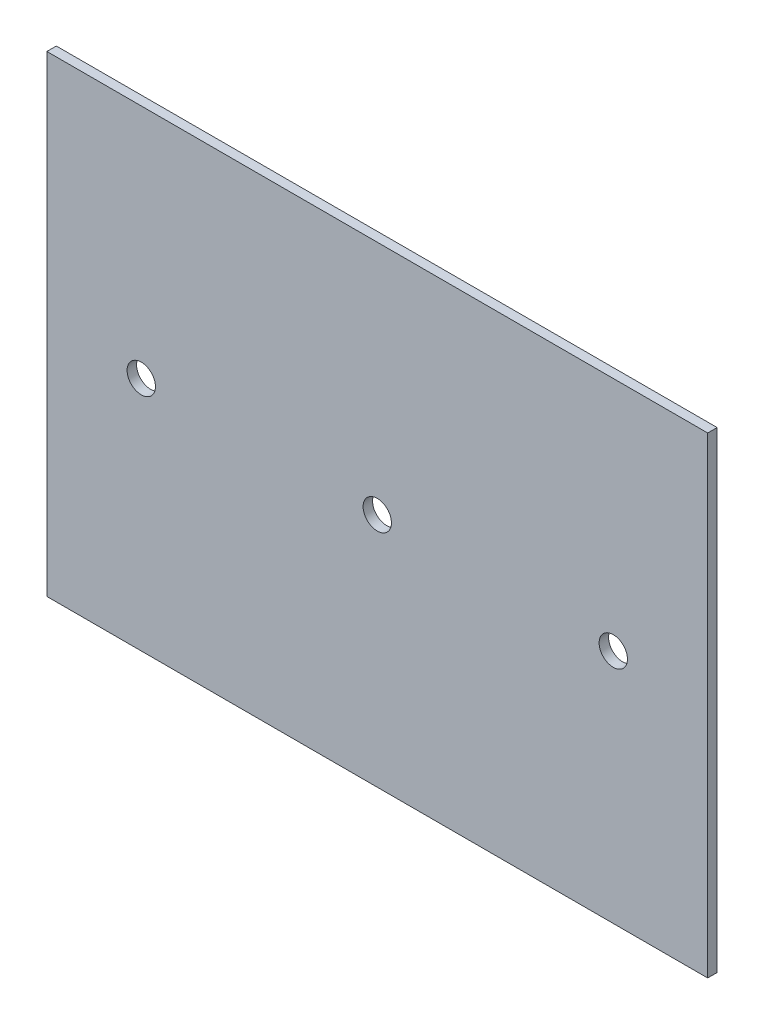
ISO-10303-21;
HEADER;
FILE_DESCRIPTION(('STEP AP214'),'2;1');
FILE_NAME('part.step','',(''),(''),'','','');
FILE_SCHEMA(('AUTOMOTIVE_DESIGN { 1 0 10303 214 1 1 1 1 }'));
ENDSEC;
DATA;
#1=APPLICATION_CONTEXT('core data for automotive mechanical design processes');
#2=APPLICATION_PROTOCOL_DEFINITION('international standard','automotive_design',2000,#1);
#3=PRODUCT_CONTEXT('',#1,'mechanical');
#4=PRODUCT('Part','Part','',(#3));
#5=PRODUCT_RELATED_PRODUCT_CATEGORY('part','',(#4));
#6=PRODUCT_DEFINITION_FORMATION('','',#4);
#7=PRODUCT_DEFINITION_CONTEXT('part definition',#1,'design');
#8=PRODUCT_DEFINITION('design','',#6,#7);
#9=PRODUCT_DEFINITION_SHAPE('','',#8);
#10=(LENGTH_UNIT() NAMED_UNIT(*) SI_UNIT(.MILLI.,.METRE.));
#11=(NAMED_UNIT(*) PLANE_ANGLE_UNIT() SI_UNIT($,.RADIAN.));
#12=(NAMED_UNIT(*) SI_UNIT($,.STERADIAN.) SOLID_ANGLE_UNIT());
#13=UNCERTAINTY_MEASURE_WITH_UNIT(LENGTH_MEASURE(1.E-05),#10,'distance_accuracy_value','');
#14=(GEOMETRIC_REPRESENTATION_CONTEXT(3) GLOBAL_UNCERTAINTY_ASSIGNED_CONTEXT((#13)) GLOBAL_UNIT_ASSIGNED_CONTEXT((#10,
#11,#12)) REPRESENTATION_CONTEXT('',''));
#15=CARTESIAN_POINT('',(0.,0.,0.));
#16=DIRECTION('',(0.,0.,1.));
#17=DIRECTION('',(1.,0.,0.));
#18=AXIS2_PLACEMENT_3D('',#15,#16,#17);
#19=CARTESIAN_POINT('',(35.,-25.,1.));
#20=DIRECTION('',(-1.,0.,0.));
#21=DIRECTION('',(0.,0.,1.));
#22=AXIS2_PLACEMENT_3D('',#19,#20,#21);
#23=PLANE('',#22);
#24=DIRECTION('',(0.,1.,0.));
#25=VECTOR('',#24,1.);
#26=CARTESIAN_POINT('',(35.,-25.,0.));
#27=LINE('',#26,#25);
#28=CARTESIAN_POINT('',(35.,-25.,0.));
#29=VERTEX_POINT('',#28);
#30=CARTESIAN_POINT('',(35.,25.,0.));
#31=VERTEX_POINT('',#30);
#32=EDGE_CURVE('E96',#29,#31,#27,.T.);
#33=ORIENTED_EDGE('',*,*,#32,.T.);
#34=DIRECTION('',(0.,0.,-1.));
#35=VECTOR('',#34,1.);
#36=CARTESIAN_POINT('',(35.,25.,1.));
#37=LINE('',#36,#35);
#38=CARTESIAN_POINT('',(35.,25.,1.));
#39=VERTEX_POINT('',#38);
#40=EDGE_CURVE('E11',#39,#31,#37,.T.);
#41=ORIENTED_EDGE('',*,*,#40,.F.);
#42=DIRECTION('',(0.,1.,0.));
#43=VECTOR('',#42,1.);
#44=CARTESIAN_POINT('',(35.,-25.,1.));
#45=LINE('',#44,#43);
#46=CARTESIAN_POINT('',(35.,-25.,1.));
#47=VERTEX_POINT('',#46);
#48=EDGE_CURVE('E84',#47,#39,#45,.T.);
#49=ORIENTED_EDGE('',*,*,#48,.F.);
#50=DIRECTION('',(0.,0.,-1.));
#51=VECTOR('',#50,1.);
#52=CARTESIAN_POINT('',(35.,-25.,1.));
#53=LINE('',#52,#51);
#54=EDGE_CURVE('E92',#47,#29,#53,.T.);
#55=ORIENTED_EDGE('',*,*,#54,.T.);
#56=EDGE_LOOP('',(#33,#41,#49,#55));
#57=FACE_BOUND('',#56,.T.);
#58=ADVANCED_FACE('F33',(#57),#23,.F.);
#59=CARTESIAN_POINT('',(-35.,25.,1.));
#60=DIRECTION('',(0.,-1.,0.));
#61=DIRECTION('',(0.,0.,-1.));
#62=AXIS2_PLACEMENT_3D('',#59,#60,#61);
#63=PLANE('',#62);
#64=DIRECTION('',(-1.,0.,0.));
#65=VECTOR('',#64,1.);
#66=CARTESIAN_POINT('',(-35.,25.,0.));
#67=LINE('',#66,#65);
#68=CARTESIAN_POINT('',(-35.,25.,0.));
#69=VERTEX_POINT('',#68);
#70=EDGE_CURVE('E88',#31,#69,#67,.T.);
#71=ORIENTED_EDGE('',*,*,#70,.T.);
#72=DIRECTION('',(0.,0.,-1.));
#73=VECTOR('',#72,1.);
#74=CARTESIAN_POINT('',(-35.,25.,1.));
#75=LINE('',#74,#73);
#76=CARTESIAN_POINT('',(-35.,25.,1.));
#77=VERTEX_POINT('',#76);
#78=EDGE_CURVE('E41',#77,#69,#75,.T.);
#79=ORIENTED_EDGE('',*,*,#78,.F.);
#80=DIRECTION('',(-1.,0.,0.));
#81=VECTOR('',#80,1.);
#82=CARTESIAN_POINT('',(-35.,25.,1.));
#83=LINE('',#82,#81);
#84=EDGE_CURVE('E79',#39,#77,#83,.T.);
#85=ORIENTED_EDGE('',*,*,#84,.F.);
#86=ORIENTED_EDGE('',*,*,#40,.T.);
#87=EDGE_LOOP('',(#71,#79,#85,#86));
#88=FACE_BOUND('',#87,.T.);
#89=ADVANCED_FACE('F87',(#88),#63,.F.);
#90=CARTESIAN_POINT('',(-35.,-25.,1.));
#91=DIRECTION('',(1.,0.,0.));
#92=DIRECTION('',(0.,0.,-1.));
#93=AXIS2_PLACEMENT_3D('',#90,#91,#92);
#94=PLANE('',#93);
#95=DIRECTION('',(0.,-1.,0.));
#96=VECTOR('',#95,1.);
#97=CARTESIAN_POINT('',(-35.,-25.,0.));
#98=LINE('',#97,#96);
#99=CARTESIAN_POINT('',(-35.,-25.,0.));
#100=VERTEX_POINT('',#99);
#101=EDGE_CURVE('E66',#69,#100,#98,.T.);
#102=ORIENTED_EDGE('',*,*,#101,.T.);
#103=DIRECTION('',(0.,0.,-1.));
#104=VECTOR('',#103,1.);
#105=CARTESIAN_POINT('',(-35.,-25.,1.));
#106=LINE('',#105,#104);
#107=CARTESIAN_POINT('',(-35.,-25.,1.));
#108=VERTEX_POINT('',#107);
#109=EDGE_CURVE('E89',#108,#100,#106,.T.);
#110=ORIENTED_EDGE('',*,*,#109,.F.);
#111=DIRECTION('',(0.,-1.,0.));
#112=VECTOR('',#111,1.);
#113=CARTESIAN_POINT('',(-35.,-25.,1.));
#114=LINE('',#113,#112);
#115=EDGE_CURVE('E82',#77,#108,#114,.T.);
#116=ORIENTED_EDGE('',*,*,#115,.F.);
#117=ORIENTED_EDGE('',*,*,#78,.T.);
#118=EDGE_LOOP('',(#102,#110,#116,#117));
#119=FACE_BOUND('',#118,.T.);
#120=ADVANCED_FACE('F90',(#119),#94,.F.);
#121=CARTESIAN_POINT('',(-35.,-25.,1.));
#122=DIRECTION('',(0.,1.,0.));
#123=DIRECTION('',(0.,0.,1.));
#124=AXIS2_PLACEMENT_3D('',#121,#122,#123);
#125=PLANE('',#124);
#126=DIRECTION('',(1.,0.,0.));
#127=VECTOR('',#126,1.);
#128=CARTESIAN_POINT('',(-35.,-25.,0.));
#129=LINE('',#128,#127);
#130=EDGE_CURVE('E72',#100,#29,#129,.T.);
#131=ORIENTED_EDGE('',*,*,#130,.T.);
#132=ORIENTED_EDGE('',*,*,#54,.F.);
#133=DIRECTION('',(1.,0.,0.));
#134=VECTOR('',#133,1.);
#135=CARTESIAN_POINT('',(-35.,-25.,1.));
#136=LINE('',#135,#134);
#137=EDGE_CURVE('E49',#108,#47,#136,.T.);
#138=ORIENTED_EDGE('',*,*,#137,.F.);
#139=ORIENTED_EDGE('',*,*,#109,.T.);
#140=EDGE_LOOP('',(#131,#132,#138,#139));
#141=FACE_BOUND('',#140,.T.);
#142=ADVANCED_FACE('F104',(#141),#125,.F.);
#143=CARTESIAN_POINT('',(0.,0.,1.));
#144=DIRECTION('',(0.,0.,-1.));
#145=DIRECTION('',(-1.,0.,0.));
#146=AXIS2_PLACEMENT_3D('',#143,#144,#145);
#147=PLANE('',#146);
#148=CARTESIAN_POINT('',(-25.,0.,1.));
#149=DIRECTION('',(0.,0.,-1.));
#150=DIRECTION('',(-1.,0.,0.));
#151=AXIS2_PLACEMENT_3D('',#148,#149,#150);
#152=CIRCLE('',#151,1.5);
#153=CARTESIAN_POINT('',(-26.5,0.,1.));
#154=VERTEX_POINT('',#153);
#155=EDGE_CURVE('E121',#154,#154,#152,.F.);
#156=ORIENTED_EDGE('',*,*,#155,.F.);
#157=EDGE_LOOP('',(#156));
#158=FACE_BOUND('',#157,.T.);
#159=CARTESIAN_POINT('',(0.,0.,1.));
#160=DIRECTION('',(0.,0.,-1.));
#161=DIRECTION('',(-1.,0.,0.));
#162=AXIS2_PLACEMENT_3D('',#159,#160,#161);
#163=CIRCLE('',#162,1.5);
#164=CARTESIAN_POINT('',(-1.5,0.,1.));
#165=VERTEX_POINT('',#164);
#166=EDGE_CURVE('E115',#165,#165,#163,.F.);
#167=ORIENTED_EDGE('',*,*,#166,.F.);
#168=EDGE_LOOP('',(#167));
#169=FACE_BOUND('',#168,.T.);
#170=CARTESIAN_POINT('',(25.,0.,1.));
#171=DIRECTION('',(0.,0.,-1.));
#172=DIRECTION('',(-1.,0.,0.));
#173=AXIS2_PLACEMENT_3D('',#170,#171,#172);
#174=CIRCLE('',#173,1.5);
#175=CARTESIAN_POINT('',(23.5,0.,1.));
#176=VERTEX_POINT('',#175);
#177=EDGE_CURVE('E99',#176,#176,#174,.F.);
#178=ORIENTED_EDGE('',*,*,#177,.F.);
#179=EDGE_LOOP('',(#178));
#180=FACE_BOUND('',#179,.T.);
#181=ORIENTED_EDGE('',*,*,#48,.T.);
#182=ORIENTED_EDGE('',*,*,#84,.T.);
#183=ORIENTED_EDGE('',*,*,#115,.T.);
#184=ORIENTED_EDGE('',*,*,#137,.T.);
#185=EDGE_LOOP('',(#181,#182,#183,#184));
#186=FACE_BOUND('',#185,.T.);
#187=ADVANCED_FACE('F80',(#158,#169,#180,#186),#147,.F.);
#188=CARTESIAN_POINT('',(0.,0.,0.));
#189=DIRECTION('',(0.,0.,-1.));
#190=DIRECTION('',(-1.,0.,0.));
#191=AXIS2_PLACEMENT_3D('',#188,#189,#190);
#192=PLANE('',#191);
#193=CARTESIAN_POINT('',(-25.,0.,0.));
#194=DIRECTION('',(0.,0.,-1.));
#195=DIRECTION('',(-1.,0.,0.));
#196=AXIS2_PLACEMENT_3D('',#193,#194,#195);
#197=CIRCLE('',#196,1.5);
#198=CARTESIAN_POINT('',(-26.5,0.,0.));
#199=VERTEX_POINT('',#198);
#200=EDGE_CURVE('E124',#199,#199,#197,.T.);
#201=ORIENTED_EDGE('',*,*,#200,.F.);
#202=EDGE_LOOP('',(#201));
#203=FACE_BOUND('',#202,.T.);
#204=CARTESIAN_POINT('',(0.,0.,0.));
#205=DIRECTION('',(0.,0.,-1.));
#206=DIRECTION('',(-1.,0.,0.));
#207=AXIS2_PLACEMENT_3D('',#204,#205,#206);
#208=CIRCLE('',#207,1.5);
#209=CARTESIAN_POINT('',(-1.5,0.,0.));
#210=VERTEX_POINT('',#209);
#211=EDGE_CURVE('E118',#210,#210,#208,.T.);
#212=ORIENTED_EDGE('',*,*,#211,.F.);
#213=EDGE_LOOP('',(#212));
#214=FACE_BOUND('',#213,.T.);
#215=CARTESIAN_POINT('',(25.,0.,0.));
#216=DIRECTION('',(0.,0.,-1.));
#217=DIRECTION('',(-1.,0.,0.));
#218=AXIS2_PLACEMENT_3D('',#215,#216,#217);
#219=CIRCLE('',#218,1.5);
#220=CARTESIAN_POINT('',(23.5,0.,0.));
#221=VERTEX_POINT('',#220);
#222=EDGE_CURVE('E112',#221,#221,#219,.T.);
#223=ORIENTED_EDGE('',*,*,#222,.F.);
#224=EDGE_LOOP('',(#223));
#225=FACE_BOUND('',#224,.T.);
#226=ORIENTED_EDGE('',*,*,#32,.F.);
#227=ORIENTED_EDGE('',*,*,#130,.F.);
#228=ORIENTED_EDGE('',*,*,#101,.F.);
#229=ORIENTED_EDGE('',*,*,#70,.F.);
#230=EDGE_LOOP('',(#226,#227,#228,#229));
#231=FACE_BOUND('',#230,.T.);
#232=ADVANCED_FACE('F107',(#203,#214,#225,#231),#192,.T.);
#233=CARTESIAN_POINT('',(25.,0.,5.24264068711929));
#234=DIRECTION('',(0.,0.,-1.));
#235=DIRECTION('',(-1.,0.,0.));
#236=AXIS2_PLACEMENT_3D('',#233,#234,#235);
#237=CYLINDRICAL_SURFACE('',#236,1.5);
#238=ORIENTED_EDGE('',*,*,#177,.T.);
#239=EDGE_LOOP('',(#238));
#240=FACE_BOUND('',#239,.T.);
#241=ORIENTED_EDGE('',*,*,#222,.T.);
#242=EDGE_LOOP('',(#241));
#243=FACE_BOUND('',#242,.T.);
#244=ADVANCED_FACE('F132',(#240,#243),#237,.F.);
#245=CARTESIAN_POINT('',(0.,0.,5.24264068711929));
#246=DIRECTION('',(0.,0.,-1.));
#247=DIRECTION('',(-1.,0.,0.));
#248=AXIS2_PLACEMENT_3D('',#245,#246,#247);
#249=CYLINDRICAL_SURFACE('',#248,1.5);
#250=ORIENTED_EDGE('',*,*,#166,.T.);
#251=EDGE_LOOP('',(#250));
#252=FACE_BOUND('',#251,.T.);
#253=ORIENTED_EDGE('',*,*,#211,.T.);
#254=EDGE_LOOP('',(#253));
#255=FACE_BOUND('',#254,.T.);
#256=ADVANCED_FACE('F139',(#252,#255),#249,.F.);
#257=CARTESIAN_POINT('',(-25.,0.,5.24264068711929));
#258=DIRECTION('',(0.,0.,-1.));
#259=DIRECTION('',(-1.,0.,0.));
#260=AXIS2_PLACEMENT_3D('',#257,#258,#259);
#261=CYLINDRICAL_SURFACE('',#260,1.5);
#262=ORIENTED_EDGE('',*,*,#155,.T.);
#263=EDGE_LOOP('',(#262));
#264=FACE_BOUND('',#263,.T.);
#265=ORIENTED_EDGE('',*,*,#200,.T.);
#266=EDGE_LOOP('',(#265));
#267=FACE_BOUND('',#266,.T.);
#268=ADVANCED_FACE('F128',(#264,#267),#261,.F.);
#269=CLOSED_SHELL('',(#58,#89,#120,#142,#187,#232,#244,#256,#268));
#270=MANIFOLD_SOLID_BREP('B2',#269);
#271=ADVANCED_BREP_SHAPE_REPRESENTATION('',(#18,#270),#14);
#272=SHAPE_DEFINITION_REPRESENTATION(#9,#271);
ENDSEC;
END-ISO-10303-21;
